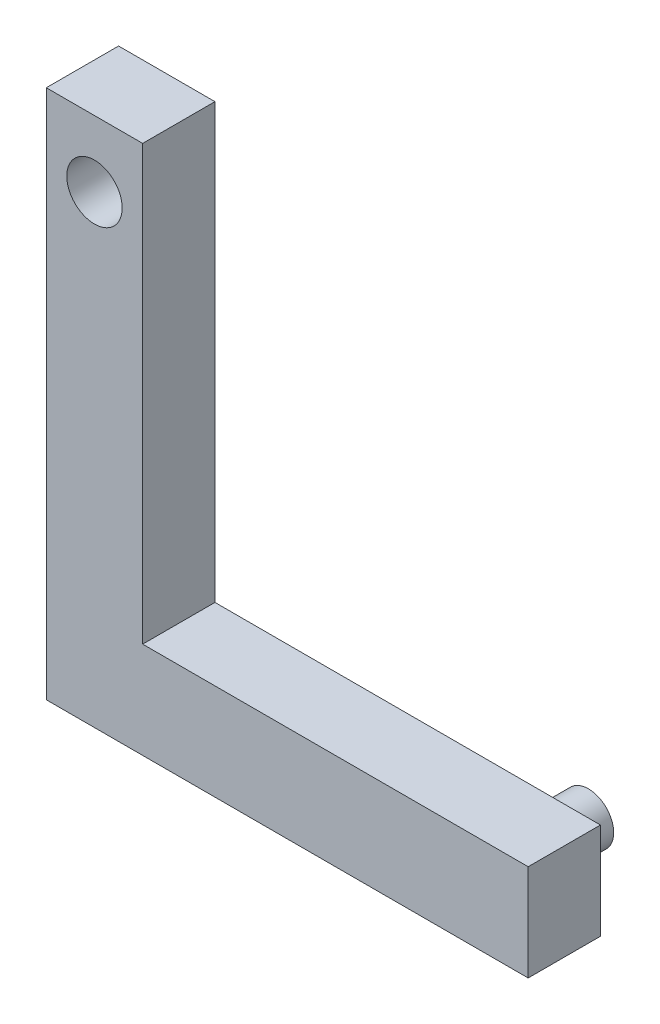
ISO-10303-21;
HEADER;
FILE_DESCRIPTION(('STEP AP214'),'2;1');
FILE_NAME('part.step','',(''),(''),'','','');
FILE_SCHEMA(('AUTOMOTIVE_DESIGN { 1 0 10303 214 1 1 1 1 }'));
ENDSEC;
DATA;
#1=APPLICATION_CONTEXT('core data for automotive mechanical design processes');
#2=APPLICATION_PROTOCOL_DEFINITION('international standard','automotive_design',2000,#1);
#3=PRODUCT_CONTEXT('',#1,'mechanical');
#4=PRODUCT('Part','Part','',(#3));
#5=PRODUCT_RELATED_PRODUCT_CATEGORY('part','',(#4));
#6=PRODUCT_DEFINITION_FORMATION('','',#4);
#7=PRODUCT_DEFINITION_CONTEXT('part definition',#1,'design');
#8=PRODUCT_DEFINITION('design','',#6,#7);
#9=PRODUCT_DEFINITION_SHAPE('','',#8);
#10=(LENGTH_UNIT() NAMED_UNIT(*) SI_UNIT(.MILLI.,.METRE.));
#11=(NAMED_UNIT(*) PLANE_ANGLE_UNIT() SI_UNIT($,.RADIAN.));
#12=(NAMED_UNIT(*) SI_UNIT($,.STERADIAN.) SOLID_ANGLE_UNIT());
#13=UNCERTAINTY_MEASURE_WITH_UNIT(LENGTH_MEASURE(1.E-05),#10,'distance_accuracy_value','');
#14=(GEOMETRIC_REPRESENTATION_CONTEXT(3) GLOBAL_UNCERTAINTY_ASSIGNED_CONTEXT((#13)) GLOBAL_UNIT_ASSIGNED_CONTEXT((#10,
#11,#12)) REPRESENTATION_CONTEXT('',''));
#15=CARTESIAN_POINT('',(0.,0.,0.));
#16=DIRECTION('',(0.,0.,1.));
#17=DIRECTION('',(1.,0.,0.));
#18=AXIS2_PLACEMENT_3D('',#15,#16,#17);
#19=CARTESIAN_POINT('',(0.,0.,3.));
#20=DIRECTION('',(0.,1.,0.));
#21=DIRECTION('',(0.,0.,1.));
#22=AXIS2_PLACEMENT_3D('',#19,#20,#21);
#23=PLANE('',#22);
#24=DIRECTION('',(1.,0.,0.));
#25=VECTOR('',#24,1.);
#26=CARTESIAN_POINT('',(0.,0.,0.));
#27=LINE('',#26,#25);
#28=CARTESIAN_POINT('',(4.,0.,0.));
#29=VERTEX_POINT('',#28);
#30=CARTESIAN_POINT('',(20.,0.,0.));
#31=VERTEX_POINT('',#30);
#32=EDGE_CURVE('E80',#29,#31,#27,.T.);
#33=ORIENTED_EDGE('',*,*,#32,.F.);
#34=DIRECTION('',(0.,0.,1.));
#35=VECTOR('',#34,1.);
#36=CARTESIAN_POINT('',(4.,0.,0.));
#37=LINE('',#36,#35);
#38=CARTESIAN_POINT('',(4.,0.,3.));
#39=VERTEX_POINT('',#38);
#40=EDGE_CURVE('E100',#29,#39,#37,.T.);
#41=ORIENTED_EDGE('',*,*,#40,.T.);
#42=DIRECTION('',(1.,0.,0.));
#43=VECTOR('',#42,1.);
#44=CARTESIAN_POINT('',(0.,0.,3.));
#45=LINE('',#44,#43);
#46=CARTESIAN_POINT('',(20.,0.,3.));
#47=VERTEX_POINT('',#46);
#48=EDGE_CURVE('E61',#39,#47,#45,.T.);
#49=ORIENTED_EDGE('',*,*,#48,.T.);
#50=DIRECTION('',(0.,0.,-1.));
#51=VECTOR('',#50,1.);
#52=CARTESIAN_POINT('',(20.,0.,3.));
#53=LINE('',#52,#51);
#54=EDGE_CURVE('E111',#47,#31,#53,.T.);
#55=ORIENTED_EDGE('',*,*,#54,.T.);
#56=EDGE_LOOP('',(#33,#41,#49,#55));
#57=FACE_BOUND('',#56,.T.);
#58=ADVANCED_FACE('F38',(#57),#23,.T.);
#59=CARTESIAN_POINT('',(0.,0.,3.));
#60=DIRECTION('',(1.,0.,0.));
#61=DIRECTION('',(0.,1.,0.));
#62=AXIS2_PLACEMENT_3D('',#59,#60,#61);
#63=PLANE('',#62);
#64=DIRECTION('',(0.,-1.,0.));
#65=VECTOR('',#64,1.);
#66=CARTESIAN_POINT('',(0.,0.,0.));
#67=LINE('',#66,#65);
#68=CARTESIAN_POINT('',(0.,18.,0.));
#69=VERTEX_POINT('',#68);
#70=CARTESIAN_POINT('',(0.,-4.,0.));
#71=VERTEX_POINT('',#70);
#72=EDGE_CURVE('E129',#69,#71,#67,.T.);
#73=ORIENTED_EDGE('',*,*,#72,.T.);
#74=DIRECTION('',(0.,0.,-1.));
#75=VECTOR('',#74,1.);
#76=CARTESIAN_POINT('',(0.,-4.,3.));
#77=LINE('',#76,#75);
#78=CARTESIAN_POINT('',(0.,-4.,3.));
#79=VERTEX_POINT('',#78);
#80=EDGE_CURVE('E46',#79,#71,#77,.T.);
#81=ORIENTED_EDGE('',*,*,#80,.F.);
#82=DIRECTION('',(0.,-1.,0.));
#83=VECTOR('',#82,1.);
#84=CARTESIAN_POINT('',(0.,0.,3.));
#85=LINE('',#84,#83);
#86=CARTESIAN_POINT('',(0.,18.,3.));
#87=VERTEX_POINT('',#86);
#88=EDGE_CURVE('E113',#87,#79,#85,.T.);
#89=ORIENTED_EDGE('',*,*,#88,.F.);
#90=DIRECTION('',(0.,0.,1.));
#91=VECTOR('',#90,1.);
#92=CARTESIAN_POINT('',(0.,18.,0.));
#93=LINE('',#92,#91);
#94=EDGE_CURVE('E131',#69,#87,#93,.T.);
#95=ORIENTED_EDGE('',*,*,#94,.F.);
#96=EDGE_LOOP('',(#73,#81,#89,#95));
#97=FACE_BOUND('',#96,.T.);
#98=ADVANCED_FACE('F40',(#97),#63,.F.);
#99=CARTESIAN_POINT('',(0.,-4.,3.));
#100=DIRECTION('',(0.,1.,0.));
#101=DIRECTION('',(0.,0.,1.));
#102=AXIS2_PLACEMENT_3D('',#99,#100,#101);
#103=PLANE('',#102);
#104=DIRECTION('',(1.,0.,0.));
#105=VECTOR('',#104,1.);
#106=CARTESIAN_POINT('',(0.,-4.,0.));
#107=LINE('',#106,#105);
#108=CARTESIAN_POINT('',(20.,-4.,0.));
#109=VERTEX_POINT('',#108);
#110=EDGE_CURVE('E117',#71,#109,#107,.T.);
#111=ORIENTED_EDGE('',*,*,#110,.T.);
#112=DIRECTION('',(0.,0.,-1.));
#113=VECTOR('',#112,1.);
#114=CARTESIAN_POINT('',(20.,-4.,3.));
#115=LINE('',#114,#113);
#116=CARTESIAN_POINT('',(20.,-4.,3.));
#117=VERTEX_POINT('',#116);
#118=EDGE_CURVE('E122',#117,#109,#115,.T.);
#119=ORIENTED_EDGE('',*,*,#118,.F.);
#120=DIRECTION('',(1.,0.,0.));
#121=VECTOR('',#120,1.);
#122=CARTESIAN_POINT('',(0.,-4.,3.));
#123=LINE('',#122,#121);
#124=EDGE_CURVE('E85',#79,#117,#123,.T.);
#125=ORIENTED_EDGE('',*,*,#124,.F.);
#126=ORIENTED_EDGE('',*,*,#80,.T.);
#127=EDGE_LOOP('',(#111,#119,#125,#126));
#128=FACE_BOUND('',#127,.T.);
#129=ADVANCED_FACE('F126',(#128),#103,.F.);
#130=CARTESIAN_POINT('',(20.,0.,3.));
#131=DIRECTION('',(1.,0.,0.));
#132=DIRECTION('',(0.,0.,-1.));
#133=AXIS2_PLACEMENT_3D('',#130,#131,#132);
#134=PLANE('',#133);
#135=DIRECTION('',(0.,-1.,0.));
#136=VECTOR('',#135,1.);
#137=CARTESIAN_POINT('',(20.,0.,0.));
#138=LINE('',#137,#136);
#139=EDGE_CURVE('E114',#31,#109,#138,.T.);
#140=ORIENTED_EDGE('',*,*,#139,.F.);
#141=ORIENTED_EDGE('',*,*,#54,.F.);
#142=DIRECTION('',(0.,-1.,0.));
#143=VECTOR('',#142,1.);
#144=CARTESIAN_POINT('',(20.,0.,3.));
#145=LINE('',#144,#143);
#146=EDGE_CURVE('E136',#47,#117,#145,.T.);
#147=ORIENTED_EDGE('',*,*,#146,.T.);
#148=ORIENTED_EDGE('',*,*,#118,.T.);
#149=EDGE_LOOP('',(#140,#141,#147,#148));
#150=FACE_BOUND('',#149,.T.);
#151=ADVANCED_FACE('F178',(#150),#134,.T.);
#152=CARTESIAN_POINT('',(0.,0.,3.));
#153=DIRECTION('',(0.,0.,1.));
#154=DIRECTION('',(1.,0.,0.));
#155=AXIS2_PLACEMENT_3D('',#152,#153,#154);
#156=PLANE('',#155);
#157=CARTESIAN_POINT('',(2.,15.25,3.));
#158=DIRECTION('',(0.,0.,1.));
#159=DIRECTION('',(1.,0.,0.));
#160=AXIS2_PLACEMENT_3D('',#157,#158,#159);
#161=CIRCLE('',#160,1.15);
#162=CARTESIAN_POINT('',(3.15,15.25,3.));
#163=VERTEX_POINT('',#162);
#164=EDGE_CURVE('E146',#163,#163,#161,.T.);
#165=ORIENTED_EDGE('',*,*,#164,.F.);
#166=EDGE_LOOP('',(#165));
#167=FACE_BOUND('',#166,.T.);
#168=ORIENTED_EDGE('',*,*,#88,.T.);
#169=ORIENTED_EDGE('',*,*,#124,.T.);
#170=ORIENTED_EDGE('',*,*,#146,.F.);
#171=ORIENTED_EDGE('',*,*,#48,.F.);
#172=DIRECTION('',(0.,1.,0.));
#173=VECTOR('',#172,1.);
#174=CARTESIAN_POINT('',(4.,0.,3.));
#175=LINE('',#174,#173);
#176=CARTESIAN_POINT('',(4.,18.,3.));
#177=VERTEX_POINT('',#176);
#178=EDGE_CURVE('E53',#39,#177,#175,.T.);
#179=ORIENTED_EDGE('',*,*,#178,.T.);
#180=DIRECTION('',(1.,0.,0.));
#181=VECTOR('',#180,1.);
#182=CARTESIAN_POINT('',(0.,18.,3.));
#183=LINE('',#182,#181);
#184=EDGE_CURVE('E109',#87,#177,#183,.T.);
#185=ORIENTED_EDGE('',*,*,#184,.F.);
#186=EDGE_LOOP('',(#168,#169,#170,#171,#179,#185));
#187=FACE_BOUND('',#186,.T.);
#188=ADVANCED_FACE('F167',(#167,#187),#156,.T.);
#189=CARTESIAN_POINT('',(0.,0.,0.));
#190=DIRECTION('',(0.,0.,1.));
#191=DIRECTION('',(1.,0.,0.));
#192=AXIS2_PLACEMENT_3D('',#189,#190,#191);
#193=PLANE('',#192);
#194=CARTESIAN_POINT('',(17.5,-2.,0.));
#195=DIRECTION('',(0.,0.,1.));
#196=DIRECTION('',(1.,0.,0.));
#197=AXIS2_PLACEMENT_3D('',#194,#195,#196);
#198=CIRCLE('',#197,1.05);
#199=CARTESIAN_POINT('',(18.55,-2.,0.));
#200=VERTEX_POINT('',#199);
#201=EDGE_CURVE('E11',#200,#200,#198,.F.);
#202=ORIENTED_EDGE('',*,*,#201,.F.);
#203=EDGE_LOOP('',(#202));
#204=FACE_BOUND('',#203,.T.);
#205=CARTESIAN_POINT('',(2.,15.25,0.));
#206=DIRECTION('',(0.,0.,1.));
#207=DIRECTION('',(1.,0.,0.));
#208=AXIS2_PLACEMENT_3D('',#205,#206,#207);
#209=CIRCLE('',#208,1.15);
#210=CARTESIAN_POINT('',(3.15,15.25,0.));
#211=VERTEX_POINT('',#210);
#212=EDGE_CURVE('E144',#211,#211,#209,.T.);
#213=ORIENTED_EDGE('',*,*,#212,.T.);
#214=EDGE_LOOP('',(#213));
#215=FACE_BOUND('',#214,.T.);
#216=ORIENTED_EDGE('',*,*,#72,.F.);
#217=DIRECTION('',(1.,0.,0.));
#218=VECTOR('',#217,1.);
#219=CARTESIAN_POINT('',(0.,18.,0.));
#220=LINE('',#219,#218);
#221=CARTESIAN_POINT('',(4.,18.,0.));
#222=VERTEX_POINT('',#221);
#223=EDGE_CURVE('E104',#69,#222,#220,.T.);
#224=ORIENTED_EDGE('',*,*,#223,.T.);
#225=DIRECTION('',(0.,1.,0.));
#226=VECTOR('',#225,1.);
#227=CARTESIAN_POINT('',(4.,0.,0.));
#228=LINE('',#227,#226);
#229=EDGE_CURVE('E102',#29,#222,#228,.T.);
#230=ORIENTED_EDGE('',*,*,#229,.F.);
#231=ORIENTED_EDGE('',*,*,#32,.T.);
#232=ORIENTED_EDGE('',*,*,#139,.T.);
#233=ORIENTED_EDGE('',*,*,#110,.F.);
#234=EDGE_LOOP('',(#216,#224,#230,#231,#232,#233));
#235=FACE_BOUND('',#234,.T.);
#236=ADVANCED_FACE('F106',(#204,#215,#235),#193,.F.);
#237=CARTESIAN_POINT('',(0.,18.,0.));
#238=DIRECTION('',(0.,-1.,0.));
#239=DIRECTION('',(0.,0.,-1.));
#240=AXIS2_PLACEMENT_3D('',#237,#238,#239);
#241=PLANE('',#240);
#242=ORIENTED_EDGE('',*,*,#184,.T.);
#243=DIRECTION('',(0.,0.,1.));
#244=VECTOR('',#243,1.);
#245=CARTESIAN_POINT('',(4.,18.,0.));
#246=LINE('',#245,#244);
#247=EDGE_CURVE('E103',#222,#177,#246,.T.);
#248=ORIENTED_EDGE('',*,*,#247,.F.);
#249=ORIENTED_EDGE('',*,*,#223,.F.);
#250=ORIENTED_EDGE('',*,*,#94,.T.);
#251=EDGE_LOOP('',(#242,#248,#249,#250));
#252=FACE_BOUND('',#251,.T.);
#253=ADVANCED_FACE('F166',(#252),#241,.F.);
#254=CARTESIAN_POINT('',(4.,0.,0.));
#255=DIRECTION('',(1.,0.,0.));
#256=DIRECTION('',(0.,0.,-1.));
#257=AXIS2_PLACEMENT_3D('',#254,#255,#256);
#258=PLANE('',#257);
#259=ORIENTED_EDGE('',*,*,#178,.F.);
#260=ORIENTED_EDGE('',*,*,#40,.F.);
#261=ORIENTED_EDGE('',*,*,#229,.T.);
#262=ORIENTED_EDGE('',*,*,#247,.T.);
#263=EDGE_LOOP('',(#259,#260,#261,#262));
#264=FACE_BOUND('',#263,.T.);
#265=ADVANCED_FACE('F101',(#264),#258,.T.);
#266=CARTESIAN_POINT('',(2.,15.25,0.));
#267=DIRECTION('',(0.,0.,1.));
#268=DIRECTION('',(1.,0.,0.));
#269=AXIS2_PLACEMENT_3D('',#266,#267,#268);
#270=CYLINDRICAL_SURFACE('',#269,1.15);
#271=ORIENTED_EDGE('',*,*,#212,.F.);
#272=EDGE_LOOP('',(#271));
#273=FACE_BOUND('',#272,.T.);
#274=ORIENTED_EDGE('',*,*,#164,.T.);
#275=EDGE_LOOP('',(#274));
#276=FACE_BOUND('',#275,.T.);
#277=ADVANCED_FACE('F160',(#273,#276),#270,.F.);
#278=CARTESIAN_POINT('',(17.5,-2.,-2.));
#279=DIRECTION('',(0.,0.,1.));
#280=DIRECTION('',(1.,0.,0.));
#281=AXIS2_PLACEMENT_3D('',#278,#279,#280);
#282=CYLINDRICAL_SURFACE('',#281,1.05);
#283=CARTESIAN_POINT('',(17.5,-2.,-2.));
#284=DIRECTION('',(0.,0.,-1.));
#285=DIRECTION('',(-1.,0.,0.));
#286=AXIS2_PLACEMENT_3D('',#283,#284,#285);
#287=CIRCLE('',#286,1.05);
#288=CARTESIAN_POINT('',(16.45,-2.,-2.));
#289=VERTEX_POINT('',#288);
#290=EDGE_CURVE('E149',#289,#289,#287,.T.);
#291=ORIENTED_EDGE('',*,*,#290,.F.);
#292=EDGE_LOOP('',(#291));
#293=FACE_BOUND('',#292,.T.);
#294=ORIENTED_EDGE('',*,*,#201,.T.);
#295=EDGE_LOOP('',(#294));
#296=FACE_BOUND('',#295,.T.);
#297=ADVANCED_FACE('F157',(#293,#296),#282,.T.);
#298=CARTESIAN_POINT('',(17.5,-2.,-2.));
#299=DIRECTION('',(0.,0.,-1.));
#300=DIRECTION('',(-1.,0.,0.));
#301=AXIS2_PLACEMENT_3D('',#298,#299,#300);
#302=PLANE('',#301);
#303=ORIENTED_EDGE('',*,*,#290,.T.);
#304=EDGE_LOOP('',(#303));
#305=FACE_BOUND('',#304,.T.);
#306=ADVANCED_FACE('F155',(#305),#302,.T.);
#307=CLOSED_SHELL('',(#58,#98,#129,#151,#188,#236,#253,#265,#277,#297,#306));
#308=MANIFOLD_SOLID_BREP('B2',#307);
#309=ADVANCED_BREP_SHAPE_REPRESENTATION('',(#18,#308),#14);
#310=SHAPE_DEFINITION_REPRESENTATION(#9,#309);
ENDSEC;
END-ISO-10303-21;
